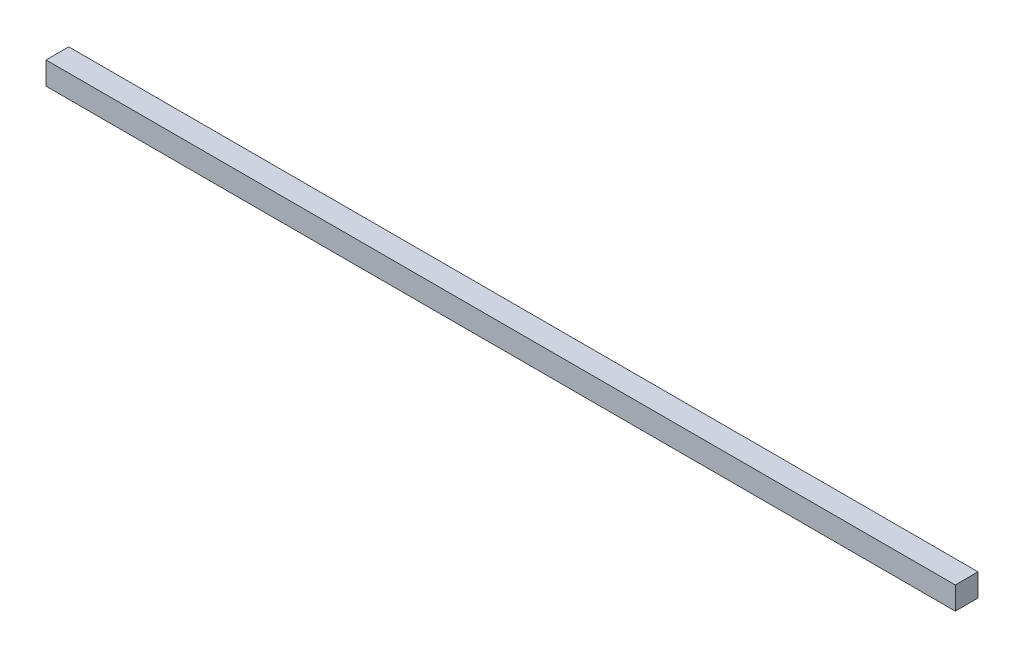
ISO-10303-21;
HEADER;
FILE_DESCRIPTION(('STEP AP214'),'2;1');
FILE_NAME('part.step','',(''),(''),'','','');
FILE_SCHEMA(('AUTOMOTIVE_DESIGN { 1 0 10303 214 1 1 1 1 }'));
ENDSEC;
DATA;
#1=APPLICATION_CONTEXT('core data for automotive mechanical design processes');
#2=APPLICATION_PROTOCOL_DEFINITION('international standard','automotive_design',2000,#1);
#3=PRODUCT_CONTEXT('',#1,'mechanical');
#4=PRODUCT('Part','Part','',(#3));
#5=PRODUCT_RELATED_PRODUCT_CATEGORY('part','',(#4));
#6=PRODUCT_DEFINITION_FORMATION('','',#4);
#7=PRODUCT_DEFINITION_CONTEXT('part definition',#1,'design');
#8=PRODUCT_DEFINITION('design','',#6,#7);
#9=PRODUCT_DEFINITION_SHAPE('','',#8);
#10=(LENGTH_UNIT() NAMED_UNIT(*) SI_UNIT(.MILLI.,.METRE.));
#11=(NAMED_UNIT(*) PLANE_ANGLE_UNIT() SI_UNIT($,.RADIAN.));
#12=(NAMED_UNIT(*) SI_UNIT($,.STERADIAN.) SOLID_ANGLE_UNIT());
#13=UNCERTAINTY_MEASURE_WITH_UNIT(LENGTH_MEASURE(1.E-05),#10,'distance_accuracy_value','');
#14=(GEOMETRIC_REPRESENTATION_CONTEXT(3) GLOBAL_UNCERTAINTY_ASSIGNED_CONTEXT((#13)) GLOBAL_UNIT_ASSIGNED_CONTEXT((#10,
#11,#12)) REPRESENTATION_CONTEXT('',''));
#15=CARTESIAN_POINT('',(0.,0.,0.));
#16=DIRECTION('',(0.,0.,1.));
#17=DIRECTION('',(1.,0.,0.));
#18=AXIS2_PLACEMENT_3D('',#15,#16,#17);
#19=CARTESIAN_POINT('',(600.,7.5,-7.5));
#20=DIRECTION('',(0.,0.,1.));
#21=DIRECTION('',(0.,-1.,0.));
#22=AXIS2_PLACEMENT_3D('',#19,#20,#21);
#23=PLANE('',#22);
#24=DIRECTION('',(0.,1.,0.));
#25=VECTOR('',#24,1.);
#26=CARTESIAN_POINT('',(0.,7.5,-7.5));
#27=LINE('',#26,#25);
#28=CARTESIAN_POINT('',(0.,-7.5,-7.5));
#29=VERTEX_POINT('',#28);
#30=CARTESIAN_POINT('',(0.,7.5,-7.5));
#31=VERTEX_POINT('',#30);
#32=EDGE_CURVE('E97',#29,#31,#27,.T.);
#33=ORIENTED_EDGE('',*,*,#32,.T.);
#34=DIRECTION('',(-1.,0.,0.));
#35=VECTOR('',#34,1.);
#36=CARTESIAN_POINT('',(600.,7.5,-7.5));
#37=LINE('',#36,#35);
#38=CARTESIAN_POINT('',(600.,7.5,-7.5));
#39=VERTEX_POINT('',#38);
#40=EDGE_CURVE('E11',#39,#31,#37,.T.);
#41=ORIENTED_EDGE('',*,*,#40,.F.);
#42=DIRECTION('',(0.,1.,0.));
#43=VECTOR('',#42,1.);
#44=CARTESIAN_POINT('',(600.,7.5,-7.5));
#45=LINE('',#44,#43);
#46=CARTESIAN_POINT('',(600.,-7.5,-7.5));
#47=VERTEX_POINT('',#46);
#48=EDGE_CURVE('E85',#47,#39,#45,.T.);
#49=ORIENTED_EDGE('',*,*,#48,.F.);
#50=DIRECTION('',(-1.,0.,0.));
#51=VECTOR('',#50,1.);
#52=CARTESIAN_POINT('',(600.,-7.5,-7.5));
#53=LINE('',#52,#51);
#54=EDGE_CURVE('E93',#47,#29,#53,.T.);
#55=ORIENTED_EDGE('',*,*,#54,.T.);
#56=EDGE_LOOP('',(#33,#41,#49,#55));
#57=FACE_BOUND('',#56,.T.);
#58=ADVANCED_FACE('F34',(#57),#23,.F.);
#59=CARTESIAN_POINT('',(600.,7.5,7.5));
#60=DIRECTION('',(0.,-1.,0.));
#61=DIRECTION('',(0.,0.,-1.));
#62=AXIS2_PLACEMENT_3D('',#59,#60,#61);
#63=PLANE('',#62);
#64=DIRECTION('',(0.,0.,1.));
#65=VECTOR('',#64,1.);
#66=CARTESIAN_POINT('',(0.,7.5,7.5));
#67=LINE('',#66,#65);
#68=CARTESIAN_POINT('',(0.,7.5,7.5));
#69=VERTEX_POINT('',#68);
#70=EDGE_CURVE('E89',#31,#69,#67,.T.);
#71=ORIENTED_EDGE('',*,*,#70,.T.);
#72=DIRECTION('',(-1.,0.,0.));
#73=VECTOR('',#72,1.);
#74=CARTESIAN_POINT('',(600.,7.5,7.5));
#75=LINE('',#74,#73);
#76=CARTESIAN_POINT('',(600.,7.5,7.5));
#77=VERTEX_POINT('',#76);
#78=EDGE_CURVE('E42',#77,#69,#75,.T.);
#79=ORIENTED_EDGE('',*,*,#78,.F.);
#80=DIRECTION('',(0.,0.,1.));
#81=VECTOR('',#80,1.);
#82=CARTESIAN_POINT('',(600.,7.5,7.5));
#83=LINE('',#82,#81);
#84=EDGE_CURVE('E80',#39,#77,#83,.T.);
#85=ORIENTED_EDGE('',*,*,#84,.F.);
#86=ORIENTED_EDGE('',*,*,#40,.T.);
#87=EDGE_LOOP('',(#71,#79,#85,#86));
#88=FACE_BOUND('',#87,.T.);
#89=ADVANCED_FACE('F88',(#88),#63,.F.);
#90=CARTESIAN_POINT('',(600.,7.5,7.5));
#91=DIRECTION('',(0.,0.,-1.));
#92=DIRECTION('',(0.,1.,0.));
#93=AXIS2_PLACEMENT_3D('',#90,#91,#92);
#94=PLANE('',#93);
#95=DIRECTION('',(0.,-1.,0.));
#96=VECTOR('',#95,1.);
#97=CARTESIAN_POINT('',(0.,7.5,7.5));
#98=LINE('',#97,#96);
#99=CARTESIAN_POINT('',(0.,-7.5,7.5));
#100=VERTEX_POINT('',#99);
#101=EDGE_CURVE('E67',#69,#100,#98,.T.);
#102=ORIENTED_EDGE('',*,*,#101,.T.);
#103=DIRECTION('',(-1.,0.,0.));
#104=VECTOR('',#103,1.);
#105=CARTESIAN_POINT('',(600.,-7.5,7.5));
#106=LINE('',#105,#104);
#107=CARTESIAN_POINT('',(600.,-7.5,7.5));
#108=VERTEX_POINT('',#107);
#109=EDGE_CURVE('E90',#108,#100,#106,.T.);
#110=ORIENTED_EDGE('',*,*,#109,.F.);
#111=DIRECTION('',(0.,-1.,0.));
#112=VECTOR('',#111,1.);
#113=CARTESIAN_POINT('',(600.,7.5,7.5));
#114=LINE('',#113,#112);
#115=EDGE_CURVE('E83',#77,#108,#114,.T.);
#116=ORIENTED_EDGE('',*,*,#115,.F.);
#117=ORIENTED_EDGE('',*,*,#78,.T.);
#118=EDGE_LOOP('',(#102,#110,#116,#117));
#119=FACE_BOUND('',#118,.T.);
#120=ADVANCED_FACE('F91',(#119),#94,.F.);
#121=CARTESIAN_POINT('',(600.,-7.5,7.5));
#122=DIRECTION('',(0.,1.,0.));
#123=DIRECTION('',(0.,0.,1.));
#124=AXIS2_PLACEMENT_3D('',#121,#122,#123);
#125=PLANE('',#124);
#126=DIRECTION('',(0.,0.,-1.));
#127=VECTOR('',#126,1.);
#128=CARTESIAN_POINT('',(0.,-7.5,7.5));
#129=LINE('',#128,#127);
#130=EDGE_CURVE('E73',#100,#29,#129,.T.);
#131=ORIENTED_EDGE('',*,*,#130,.T.);
#132=ORIENTED_EDGE('',*,*,#54,.F.);
#133=DIRECTION('',(0.,0.,-1.));
#134=VECTOR('',#133,1.);
#135=CARTESIAN_POINT('',(600.,-7.5,7.5));
#136=LINE('',#135,#134);
#137=EDGE_CURVE('E50',#108,#47,#136,.T.);
#138=ORIENTED_EDGE('',*,*,#137,.F.);
#139=ORIENTED_EDGE('',*,*,#109,.T.);
#140=EDGE_LOOP('',(#131,#132,#138,#139));
#141=FACE_BOUND('',#140,.T.);
#142=ADVANCED_FACE('F104',(#141),#125,.F.);
#143=CARTESIAN_POINT('',(600.,0.,0.));
#144=DIRECTION('',(1.,0.,0.));
#145=DIRECTION('',(0.,0.,-1.));
#146=AXIS2_PLACEMENT_3D('',#143,#144,#145);
#147=PLANE('',#146);
#148=ORIENTED_EDGE('',*,*,#48,.T.);
#149=ORIENTED_EDGE('',*,*,#84,.T.);
#150=ORIENTED_EDGE('',*,*,#115,.T.);
#151=ORIENTED_EDGE('',*,*,#137,.T.);
#152=EDGE_LOOP('',(#148,#149,#150,#151));
#153=FACE_BOUND('',#152,.T.);
#154=ADVANCED_FACE('F81',(#153),#147,.T.);
#155=CARTESIAN_POINT('',(0.,0.,0.));
#156=DIRECTION('',(1.,0.,0.));
#157=DIRECTION('',(0.,0.,-1.));
#158=AXIS2_PLACEMENT_3D('',#155,#156,#157);
#159=PLANE('',#158);
#160=ORIENTED_EDGE('',*,*,#32,.F.);
#161=ORIENTED_EDGE('',*,*,#130,.F.);
#162=ORIENTED_EDGE('',*,*,#101,.F.);
#163=ORIENTED_EDGE('',*,*,#70,.F.);
#164=EDGE_LOOP('',(#160,#161,#162,#163));
#165=FACE_BOUND('',#164,.T.);
#166=ADVANCED_FACE('F107',(#165),#159,.F.);
#167=CLOSED_SHELL('',(#58,#89,#120,#142,#154,#166));
#168=MANIFOLD_SOLID_BREP('B2',#167);
#169=ADVANCED_BREP_SHAPE_REPRESENTATION('',(#18,#168),#14);
#170=SHAPE_DEFINITION_REPRESENTATION(#9,#169);
ENDSEC;
END-ISO-10303-21;
